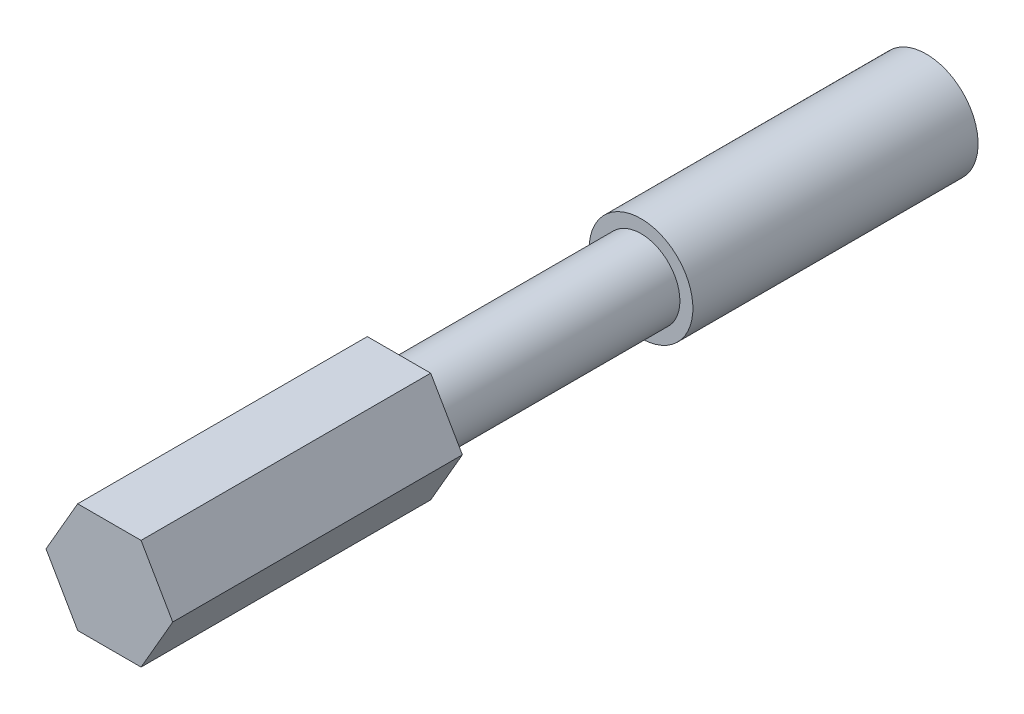
ISO-10303-21;
HEADER;
FILE_DESCRIPTION(('STEP AP214'),'2;1');
FILE_NAME('part.step','',(''),(''),'','','');
FILE_SCHEMA(('AUTOMOTIVE_DESIGN { 1 0 10303 214 1 1 1 1 }'));
ENDSEC;
DATA;
#1=APPLICATION_CONTEXT('core data for automotive mechanical design processes');
#2=APPLICATION_PROTOCOL_DEFINITION('international standard','automotive_design',2000,#1);
#3=PRODUCT_CONTEXT('',#1,'mechanical');
#4=PRODUCT('Part','Part','',(#3));
#5=PRODUCT_RELATED_PRODUCT_CATEGORY('part','',(#4));
#6=PRODUCT_DEFINITION_FORMATION('','',#4);
#7=PRODUCT_DEFINITION_CONTEXT('part definition',#1,'design');
#8=PRODUCT_DEFINITION('design','',#6,#7);
#9=PRODUCT_DEFINITION_SHAPE('','',#8);
#10=(LENGTH_UNIT() NAMED_UNIT(*) SI_UNIT(.MILLI.,.METRE.));
#11=(NAMED_UNIT(*) PLANE_ANGLE_UNIT() SI_UNIT($,.RADIAN.));
#12=(NAMED_UNIT(*) SI_UNIT($,.STERADIAN.) SOLID_ANGLE_UNIT());
#13=UNCERTAINTY_MEASURE_WITH_UNIT(LENGTH_MEASURE(1.E-05),#10,'distance_accuracy_value','');
#14=(GEOMETRIC_REPRESENTATION_CONTEXT(3) GLOBAL_UNCERTAINTY_ASSIGNED_CONTEXT((#13)) GLOBAL_UNIT_ASSIGNED_CONTEXT((#10,
#11,#12)) REPRESENTATION_CONTEXT('',''));
#15=CARTESIAN_POINT('',(0.,0.,0.));
#16=DIRECTION('',(0.,0.,1.));
#17=DIRECTION('',(1.,0.,0.));
#18=AXIS2_PLACEMENT_3D('',#15,#16,#17);
#19=CARTESIAN_POINT('',(0.,0.,-61.));
#20=DIRECTION('',(0.,0.,1.));
#21=DIRECTION('',(1.,0.,0.));
#22=AXIS2_PLACEMENT_3D('',#19,#20,#21);
#23=CYLINDRICAL_SURFACE('',#22,4.5);
#24=CARTESIAN_POINT('',(0.,0.,0.));
#25=DIRECTION('',(0.,0.,-1.));
#26=DIRECTION('',(-1.,0.,0.));
#27=AXIS2_PLACEMENT_3D('',#24,#25,#26);
#28=CIRCLE('',#27,4.5);
#29=CARTESIAN_POINT('',(4.5,0.,0.));
#30=VERTEX_POINT('',#29);
#31=EDGE_CURVE('E51',#30,#30,#28,.T.);
#32=CARTESIAN_POINT('',(0.,0.,-28.));
#33=DIRECTION('',(0.,0.,-1.));
#34=DIRECTION('',(-1.,0.,0.));
#35=AXIS2_PLACEMENT_3D('',#32,#33,#34);
#36=CIRCLE('',#35,4.5);
#37=CARTESIAN_POINT('',(4.5,0.,-28.));
#38=VERTEX_POINT('',#37);
#39=EDGE_CURVE('E11',#38,#38,#36,.T.);
#40=CARTESIAN_POINT('',(4.5,0.,0.));
#41=CARTESIAN_POINT('',(4.5,0.,-0.291666666666659));
#42=CARTESIAN_POINT('',(4.5,0.,-0.583333333333327));
#43=CARTESIAN_POINT('',(4.5,0.,-1.16666666666666));
#44=CARTESIAN_POINT('',(4.5,0.,-1.45833333333333));
#45=CARTESIAN_POINT('',(4.5,0.,-2.04166666666666));
#46=CARTESIAN_POINT('',(4.5,0.,-2.33333333333333));
#47=CARTESIAN_POINT('',(4.5,0.,-2.91666666666666));
#48=CARTESIAN_POINT('',(4.5,0.,-3.20833333333333));
#49=CARTESIAN_POINT('',(4.5,0.,-3.79166666666666));
#50=CARTESIAN_POINT('',(4.5,0.,-4.08333333333333));
#51=CARTESIAN_POINT('',(4.5,0.,-4.66666666666666));
#52=CARTESIAN_POINT('',(4.5,0.,-4.95833333333332));
#53=CARTESIAN_POINT('',(4.5,0.,-5.54166666666666));
#54=CARTESIAN_POINT('',(4.5,0.,-5.83333333333333));
#55=CARTESIAN_POINT('',(4.5,0.,-6.41666666666666));
#56=CARTESIAN_POINT('',(4.5,0.,-6.70833333333333));
#57=CARTESIAN_POINT('',(4.5,0.,-7.29166666666666));
#58=CARTESIAN_POINT('',(4.5,0.,-7.58333333333333));
#59=CARTESIAN_POINT('',(4.5,0.,-8.16666666666666));
#60=CARTESIAN_POINT('',(4.5,0.,-8.45833333333333));
#61=CARTESIAN_POINT('',(4.5,0.,-9.04166666666666));
#62=CARTESIAN_POINT('',(4.5,0.,-9.33333333333332));
#63=CARTESIAN_POINT('',(4.5,0.,-9.91666666666666));
#64=CARTESIAN_POINT('',(4.5,0.,-10.2083333333333));
#65=CARTESIAN_POINT('',(4.5,0.,-10.7916666666667));
#66=CARTESIAN_POINT('',(4.5,0.,-11.0833333333333));
#67=CARTESIAN_POINT('',(4.5,0.,-11.6666666666667));
#68=CARTESIAN_POINT('',(4.5,0.,-11.9583333333333));
#69=CARTESIAN_POINT('',(4.5,0.,-12.5416666666667));
#70=CARTESIAN_POINT('',(4.5,0.,-12.8333333333333));
#71=CARTESIAN_POINT('',(4.5,0.,-13.4166666666667));
#72=CARTESIAN_POINT('',(4.5,0.,-13.7083333333333));
#73=CARTESIAN_POINT('',(4.5,0.,-14.2916666666667));
#74=CARTESIAN_POINT('',(4.5,0.,-14.5833333333333));
#75=CARTESIAN_POINT('',(4.5,0.,-15.1666666666667));
#76=CARTESIAN_POINT('',(4.5,0.,-15.4583333333333));
#77=CARTESIAN_POINT('',(4.5,0.,-16.0416666666667));
#78=CARTESIAN_POINT('',(4.5,0.,-16.3333333333333));
#79=CARTESIAN_POINT('',(4.5,0.,-16.9166666666667));
#80=CARTESIAN_POINT('',(4.5,0.,-17.2083333333333));
#81=CARTESIAN_POINT('',(4.5,0.,-17.7916666666667));
#82=CARTESIAN_POINT('',(4.5,0.,-18.0833333333333));
#83=CARTESIAN_POINT('',(4.5,0.,-18.6666666666667));
#84=CARTESIAN_POINT('',(4.5,0.,-18.9583333333333));
#85=CARTESIAN_POINT('',(4.5,0.,-19.5416666666667));
#86=CARTESIAN_POINT('',(4.5,0.,-19.8333333333333));
#87=CARTESIAN_POINT('',(4.5,0.,-20.4166666666667));
#88=CARTESIAN_POINT('',(4.5,0.,-20.7083333333333));
#89=CARTESIAN_POINT('',(4.5,0.,-21.2916666666667));
#90=CARTESIAN_POINT('',(4.5,0.,-21.5833333333333));
#91=CARTESIAN_POINT('',(4.5,0.,-22.1666666666667));
#92=CARTESIAN_POINT('',(4.5,0.,-22.4583333333333));
#93=CARTESIAN_POINT('',(4.5,0.,-23.0416666666667));
#94=CARTESIAN_POINT('',(4.5,0.,-23.3333333333333));
#95=CARTESIAN_POINT('',(4.5,0.,-23.9166666666667));
#96=CARTESIAN_POINT('',(4.5,0.,-24.2083333333333));
#97=CARTESIAN_POINT('',(4.5,0.,-24.7916666666667));
#98=CARTESIAN_POINT('',(4.5,0.,-25.0833333333333));
#99=CARTESIAN_POINT('',(4.5,0.,-25.6666666666667));
#100=CARTESIAN_POINT('',(4.5,0.,-25.9583333333333));
#101=CARTESIAN_POINT('',(4.5,0.,-26.5416666666667));
#102=CARTESIAN_POINT('',(4.5,0.,-26.8333333333333));
#103=CARTESIAN_POINT('',(4.5,0.,-27.4166666666667));
#104=CARTESIAN_POINT('',(4.5,0.,-27.7083333333333));
#105=CARTESIAN_POINT('',(4.5,0.,-28.));
#106=B_SPLINE_CURVE_WITH_KNOTS('',3,(#40,#41,#42,#43,#44,#45,#46,#47,#48,#49,#50,#51,#52,#53,
#54,#55,#56,#57,#58,#59,#60,#61,#62,#63,#64,#65,#66,#67,#68,#69,#70,#71,#72,#73,#74,#75,#76,#77,
#78,#79,#80,#81,#82,#83,#84,#85,#86,#87,#88,#89,#90,#91,#92,#93,#94,#95,#96,#97,#98,#99,#100,
#101,#102,#103,#104,#105),.UNSPECIFIED.,.F.,.F.,(4,2,2,2,2,2,2,2,2,2,2,2,2,2,2,2,2,2,2,2,2,2,2,
2,2,2,2,2,2,2,2,2,4),(0.,0.875000000000001,1.75,2.625,3.5,4.375,5.25,6.125,7.,7.875,8.75,
9.62499999999999,10.5,11.375,12.25,13.125,14.,14.875,15.75,16.625,17.5,18.375,19.25,20.125,21.,
21.875,22.75,23.625,24.5,25.375,26.25,27.125,28.),.UNSPECIFIED.);
#107=EDGE_CURVE('BSEAM43',#30,#38,#106,.T.);
#108=ORIENTED_EDGE('',*,*,#31,.T.);
#109=ORIENTED_EDGE('',*,*,#39,.F.);
#110=ORIENTED_EDGE('',*,*,#107,.T.);
#111=ORIENTED_EDGE('',*,*,#107,.F.);
#112=EDGE_LOOP('',(#108,#110,#109,#111));
#113=FACE_BOUND('',#112,.T.);
#114=ADVANCED_FACE('F43',(#113),#23,.T.);
#115=CARTESIAN_POINT('',(-3.66617420935412,-6.35,27.));
#116=DIRECTION('',(0.,1.,0.));
#117=DIRECTION('',(-1.,0.,0.));
#118=AXIS2_PLACEMENT_3D('',#115,#116,#117);
#119=PLANE('',#118);
#120=DIRECTION('',(1.,0.,0.));
#121=VECTOR('',#120,1.);
#122=CARTESIAN_POINT('',(-3.66617420935412,-6.35,0.));
#123=LINE('',#122,#121);
#124=CARTESIAN_POINT('',(-3.66617420935412,-6.35,0.));
#125=VERTEX_POINT('',#124);
#126=CARTESIAN_POINT('',(3.66617420935412,-6.35,0.));
#127=VERTEX_POINT('',#126);
#128=EDGE_CURVE('E187',#125,#127,#123,.T.);
#129=ORIENTED_EDGE('',*,*,#128,.T.);
#130=DIRECTION('',(0.,0.,-1.));
#131=VECTOR('',#130,1.);
#132=CARTESIAN_POINT('',(3.66617420935412,-6.35,27.));
#133=LINE('',#132,#131);
#134=CARTESIAN_POINT('',(3.66617420935412,-6.35,33.51));
#135=VERTEX_POINT('',#134);
#136=EDGE_CURVE('E195',#135,#127,#133,.T.);
#137=ORIENTED_EDGE('',*,*,#136,.F.);
#138=DIRECTION('',(1.,0.,0.));
#139=VECTOR('',#138,1.);
#140=CARTESIAN_POINT('',(-3.66617420935412,-6.35,33.51));
#141=LINE('',#140,#139);
#142=CARTESIAN_POINT('',(-3.66617420935412,-6.35,33.51));
#143=VERTEX_POINT('',#142);
#144=EDGE_CURVE('E150',#143,#135,#141,.T.);
#145=ORIENTED_EDGE('',*,*,#144,.F.);
#146=DIRECTION('',(0.,0.,-1.));
#147=VECTOR('',#146,1.);
#148=CARTESIAN_POINT('',(-3.66617420935412,-6.35,27.));
#149=LINE('',#148,#147);
#150=EDGE_CURVE('E206',#143,#125,#149,.T.);
#151=ORIENTED_EDGE('',*,*,#150,.T.);
#152=EDGE_LOOP('',(#129,#137,#145,#151));
#153=FACE_BOUND('',#152,.T.);
#154=ADVANCED_FACE('F45',(#153),#119,.F.);
#155=CARTESIAN_POINT('',(3.66617420935412,-6.35,27.));
#156=DIRECTION('',(-0.866025403784439,0.5,0.));
#157=DIRECTION('',(-0.5,-0.866025403784439,0.));
#158=AXIS2_PLACEMENT_3D('',#155,#156,#157);
#159=PLANE('',#158);
#160=DIRECTION('',(0.5,0.866025403784439,0.));
#161=VECTOR('',#160,1.);
#162=CARTESIAN_POINT('',(3.66617420935412,-6.35,0.));
#163=LINE('',#162,#161);
#164=CARTESIAN_POINT('',(7.33234841870825,0.,0.));
#165=VERTEX_POINT('',#164);
#166=EDGE_CURVE('E198',#127,#165,#163,.T.);
#167=ORIENTED_EDGE('',*,*,#166,.T.);
#168=DIRECTION('',(0.,0.,-1.));
#169=VECTOR('',#168,1.);
#170=CARTESIAN_POINT('',(7.33234841870825,0.,27.));
#171=LINE('',#170,#169);
#172=CARTESIAN_POINT('',(7.33234841870825,0.,33.51));
#173=VERTEX_POINT('',#172);
#174=EDGE_CURVE('E210',#173,#165,#171,.T.);
#175=ORIENTED_EDGE('',*,*,#174,.F.);
#176=DIRECTION('',(0.5,0.866025403784439,0.));
#177=VECTOR('',#176,1.);
#178=CARTESIAN_POINT('',(3.66617420935412,-6.35,33.51));
#179=LINE('',#178,#177);
#180=EDGE_CURVE('E153',#135,#173,#179,.T.);
#181=ORIENTED_EDGE('',*,*,#180,.F.);
#182=ORIENTED_EDGE('',*,*,#136,.T.);
#183=EDGE_LOOP('',(#167,#175,#181,#182));
#184=FACE_BOUND('',#183,.T.);
#185=ADVANCED_FACE('F215',(#184),#159,.F.);
#186=CARTESIAN_POINT('',(7.33234841870825,0.,27.));
#187=DIRECTION('',(-0.866025403784439,-0.5,0.));
#188=DIRECTION('',(0.5,-0.866025403784439,0.));
#189=AXIS2_PLACEMENT_3D('',#186,#187,#188);
#190=PLANE('',#189);
#191=DIRECTION('',(-0.5,0.866025403784439,0.));
#192=VECTOR('',#191,1.);
#193=CARTESIAN_POINT('',(7.33234841870825,0.,0.));
#194=LINE('',#193,#192);
#195=CARTESIAN_POINT('',(3.66617420935412,6.35,0.));
#196=VERTEX_POINT('',#195);
#197=EDGE_CURVE('E200',#165,#196,#194,.T.);
#198=ORIENTED_EDGE('',*,*,#197,.T.);
#199=DIRECTION('',(0.,0.,-1.));
#200=VECTOR('',#199,1.);
#201=CARTESIAN_POINT('',(3.66617420935412,6.35,27.));
#202=LINE('',#201,#200);
#203=CARTESIAN_POINT('',(3.66617420935412,6.35,33.51));
#204=VERTEX_POINT('',#203);
#205=EDGE_CURVE('E131',#204,#196,#202,.T.);
#206=ORIENTED_EDGE('',*,*,#205,.F.);
#207=DIRECTION('',(-0.5,0.866025403784439,0.));
#208=VECTOR('',#207,1.);
#209=CARTESIAN_POINT('',(7.33234841870825,0.,33.51));
#210=LINE('',#209,#208);
#211=EDGE_CURVE('E146',#173,#204,#210,.T.);
#212=ORIENTED_EDGE('',*,*,#211,.F.);
#213=ORIENTED_EDGE('',*,*,#174,.T.);
#214=EDGE_LOOP('',(#198,#206,#212,#213));
#215=FACE_BOUND('',#214,.T.);
#216=ADVANCED_FACE('F223',(#215),#190,.F.);
#217=CARTESIAN_POINT('',(3.66617420935412,6.35,27.));
#218=DIRECTION('',(0.,-1.,0.));
#219=DIRECTION('',(1.,0.,0.));
#220=AXIS2_PLACEMENT_3D('',#217,#218,#219);
#221=PLANE('',#220);
#222=DIRECTION('',(-1.,0.,0.));
#223=VECTOR('',#222,1.);
#224=CARTESIAN_POINT('',(3.66617420935412,6.35,0.));
#225=LINE('',#224,#223);
#226=CARTESIAN_POINT('',(-3.66617420935412,6.35,0.));
#227=VERTEX_POINT('',#226);
#228=EDGE_CURVE('E128',#196,#227,#225,.T.);
#229=ORIENTED_EDGE('',*,*,#228,.T.);
#230=DIRECTION('',(0.,0.,-1.));
#231=VECTOR('',#230,1.);
#232=CARTESIAN_POINT('',(-3.66617420935412,6.35,27.));
#233=LINE('',#232,#231);
#234=CARTESIAN_POINT('',(-3.66617420935412,6.35,33.51));
#235=VERTEX_POINT('',#234);
#236=EDGE_CURVE('E121',#235,#227,#233,.T.);
#237=ORIENTED_EDGE('',*,*,#236,.F.);
#238=DIRECTION('',(-1.,0.,0.));
#239=VECTOR('',#238,1.);
#240=CARTESIAN_POINT('',(3.66617420935412,6.35,33.51));
#241=LINE('',#240,#239);
#242=EDGE_CURVE('E126',#204,#235,#241,.T.);
#243=ORIENTED_EDGE('',*,*,#242,.F.);
#244=ORIENTED_EDGE('',*,*,#205,.T.);
#245=EDGE_LOOP('',(#229,#237,#243,#244));
#246=FACE_BOUND('',#245,.T.);
#247=ADVANCED_FACE('F123',(#246),#221,.F.);
#248=CARTESIAN_POINT('',(-3.66617420935412,6.35,27.));
#249=DIRECTION('',(0.866025403784439,-0.5,0.));
#250=DIRECTION('',(0.5,0.866025403784439,0.));
#251=AXIS2_PLACEMENT_3D('',#248,#249,#250);
#252=PLANE('',#251);
#253=DIRECTION('',(-0.5,-0.866025403784439,0.));
#254=VECTOR('',#253,1.);
#255=CARTESIAN_POINT('',(-3.66617420935412,6.35,0.));
#256=LINE('',#255,#254);
#257=CARTESIAN_POINT('',(-7.33234841870825,0.,0.));
#258=VERTEX_POINT('',#257);
#259=EDGE_CURVE('E203',#227,#258,#256,.T.);
#260=ORIENTED_EDGE('',*,*,#259,.T.);
#261=DIRECTION('',(0.,0.,-1.));
#262=VECTOR('',#261,1.);
#263=CARTESIAN_POINT('',(-7.33234841870825,0.,27.));
#264=LINE('',#263,#262);
#265=CARTESIAN_POINT('',(-7.33234841870825,0.,33.51));
#266=VERTEX_POINT('',#265);
#267=EDGE_CURVE('E132',#266,#258,#264,.T.);
#268=ORIENTED_EDGE('',*,*,#267,.F.);
#269=DIRECTION('',(-0.5,-0.866025403784439,0.));
#270=VECTOR('',#269,1.);
#271=CARTESIAN_POINT('',(-3.66617420935412,6.35,33.51));
#272=LINE('',#271,#270);
#273=EDGE_CURVE('E135',#235,#266,#272,.T.);
#274=ORIENTED_EDGE('',*,*,#273,.F.);
#275=ORIENTED_EDGE('',*,*,#236,.T.);
#276=EDGE_LOOP('',(#260,#268,#274,#275));
#277=FACE_BOUND('',#276,.T.);
#278=ADVANCED_FACE('F136',(#277),#252,.F.);
#279=CARTESIAN_POINT('',(-7.33234841870825,0.,27.));
#280=DIRECTION('',(0.866025403784439,0.5,0.));
#281=DIRECTION('',(-0.5,0.866025403784439,0.));
#282=AXIS2_PLACEMENT_3D('',#279,#280,#281);
#283=PLANE('',#282);
#284=DIRECTION('',(0.5,-0.866025403784439,0.));
#285=VECTOR('',#284,1.);
#286=CARTESIAN_POINT('',(-7.33234841870825,0.,0.));
#287=LINE('',#286,#285);
#288=EDGE_CURVE('E66',#258,#125,#287,.T.);
#289=ORIENTED_EDGE('',*,*,#288,.T.);
#290=ORIENTED_EDGE('',*,*,#150,.F.);
#291=DIRECTION('',(0.5,-0.866025403784439,0.));
#292=VECTOR('',#291,1.);
#293=CARTESIAN_POINT('',(-7.33234841870825,0.,33.51));
#294=LINE('',#293,#292);
#295=EDGE_CURVE('E140',#266,#143,#294,.T.);
#296=ORIENTED_EDGE('',*,*,#295,.F.);
#297=ORIENTED_EDGE('',*,*,#267,.T.);
#298=EDGE_LOOP('',(#289,#290,#296,#297));
#299=FACE_BOUND('',#298,.T.);
#300=ADVANCED_FACE('F224',(#299),#283,.F.);
#301=CARTESIAN_POINT('',(0.,0.,0.));
#302=DIRECTION('',(0.,0.,1.));
#303=DIRECTION('',(1.,0.,0.));
#304=AXIS2_PLACEMENT_3D('',#301,#302,#303);
#305=PLANE('',#304);
#306=ORIENTED_EDGE('',*,*,#31,.F.);
#307=EDGE_LOOP('',(#306));
#308=FACE_BOUND('',#307,.T.);
#309=ORIENTED_EDGE('',*,*,#128,.F.);
#310=ORIENTED_EDGE('',*,*,#288,.F.);
#311=ORIENTED_EDGE('',*,*,#259,.F.);
#312=ORIENTED_EDGE('',*,*,#228,.F.);
#313=ORIENTED_EDGE('',*,*,#197,.F.);
#314=ORIENTED_EDGE('',*,*,#166,.F.);
#315=EDGE_LOOP('',(#309,#310,#311,#312,#313,#314));
#316=FACE_BOUND('',#315,.T.);
#317=ADVANCED_FACE('F220',(#308,#316),#305,.F.);
#318=CARTESIAN_POINT('',(0.,0.,-28.));
#319=DIRECTION('',(0.,0.,-1.));
#320=DIRECTION('',(-1.,0.,0.));
#321=AXIS2_PLACEMENT_3D('',#318,#319,#320);
#322=CYLINDRICAL_SURFACE('',#321,6.);
#323=CARTESIAN_POINT('',(0.,0.,-28.));
#324=DIRECTION('',(0.,0.,-1.));
#325=DIRECTION('',(-1.,0.,0.));
#326=AXIS2_PLACEMENT_3D('',#323,#324,#325);
#327=CIRCLE('',#326,6.);
#328=CARTESIAN_POINT('',(-6.,0.,-28.));
#329=VERTEX_POINT('',#328);
#330=EDGE_CURVE('E157',#329,#329,#327,.T.);
#331=ORIENTED_EDGE('',*,*,#330,.T.);
#332=EDGE_LOOP('',(#331));
#333=FACE_BOUND('',#332,.T.);
#334=CARTESIAN_POINT('',(0.,0.,-61.));
#335=DIRECTION('',(0.,0.,-1.));
#336=DIRECTION('',(-1.,0.,0.));
#337=AXIS2_PLACEMENT_3D('',#334,#335,#336);
#338=CIRCLE('',#337,6.);
#339=CARTESIAN_POINT('',(-6.,0.,-61.));
#340=VERTEX_POINT('',#339);
#341=EDGE_CURVE('E156',#340,#340,#338,.T.);
#342=ORIENTED_EDGE('',*,*,#341,.F.);
#343=EDGE_LOOP('',(#342));
#344=FACE_BOUND('',#343,.T.);
#345=ADVANCED_FACE('F232',(#333,#344),#322,.T.);
#346=CARTESIAN_POINT('',(0.,0.,-28.));
#347=DIRECTION('',(0.,0.,-1.));
#348=DIRECTION('',(-1.,0.,0.));
#349=AXIS2_PLACEMENT_3D('',#346,#347,#348);
#350=PLANE('',#349);
#351=ORIENTED_EDGE('',*,*,#39,.T.);
#352=EDGE_LOOP('',(#351));
#353=FACE_BOUND('',#352,.T.);
#354=ORIENTED_EDGE('',*,*,#330,.F.);
#355=EDGE_LOOP('',(#354));
#356=FACE_BOUND('',#355,.T.);
#357=ADVANCED_FACE('F267',(#353,#356),#350,.F.);
#358=CARTESIAN_POINT('',(0.,0.,-47.));
#359=DIRECTION('',(0.,0.,-1.));
#360=DIRECTION('',(-1.,0.,0.));
#361=AXIS2_PLACEMENT_3D('',#358,#359,#360);
#362=PLANE('',#361);
#363=CARTESIAN_POINT('',(0.,0.,-47.));
#364=DIRECTION('',(0.,0.,-1.));
#365=DIRECTION('',(-1.,0.,0.));
#366=AXIS2_PLACEMENT_3D('',#363,#364,#365);
#367=CIRCLE('',#366,4.);
#368=CARTESIAN_POINT('',(2.64575131106459,3.,-47.));
#369=VERTEX_POINT('',#368);
#370=CARTESIAN_POINT('',(2.64575131106459,-3.,-47.));
#371=VERTEX_POINT('',#370);
#372=EDGE_CURVE('E162',#369,#371,#367,.T.);
#373=ORIENTED_EDGE('',*,*,#372,.T.);
#374=DIRECTION('',(-1.,0.,0.));
#375=VECTOR('',#374,1.);
#376=CARTESIAN_POINT('',(2.64575131106459,-3.,-47.));
#377=LINE('',#376,#375);
#378=CARTESIAN_POINT('',(-2.64575131106459,-3.,-47.));
#379=VERTEX_POINT('',#378);
#380=EDGE_CURVE('E165',#371,#379,#377,.T.);
#381=ORIENTED_EDGE('',*,*,#380,.T.);
#382=CARTESIAN_POINT('',(0.,0.,-47.));
#383=DIRECTION('',(0.,0.,-1.));
#384=DIRECTION('',(-1.,0.,0.));
#385=AXIS2_PLACEMENT_3D('',#382,#383,#384);
#386=CIRCLE('',#385,4.);
#387=CARTESIAN_POINT('',(-2.64575131106459,3.,-47.));
#388=VERTEX_POINT('',#387);
#389=EDGE_CURVE('E169',#379,#388,#386,.T.);
#390=ORIENTED_EDGE('',*,*,#389,.T.);
#391=DIRECTION('',(1.,0.,0.));
#392=VECTOR('',#391,1.);
#393=CARTESIAN_POINT('',(2.64575131106459,3.,-47.));
#394=LINE('',#393,#392);
#395=EDGE_CURVE('E172',#388,#369,#394,.T.);
#396=ORIENTED_EDGE('',*,*,#395,.T.);
#397=EDGE_LOOP('',(#373,#381,#390,#396));
#398=FACE_BOUND('',#397,.T.);
#399=ADVANCED_FACE('F258',(#398),#362,.T.);
#400=CARTESIAN_POINT('',(2.64575131106459,-3.,-47.));
#401=DIRECTION('',(0.,-1.,0.));
#402=DIRECTION('',(0.,0.,-1.));
#403=AXIS2_PLACEMENT_3D('',#400,#401,#402);
#404=PLANE('',#403);
#405=DIRECTION('',(-1.,0.,0.));
#406=VECTOR('',#405,1.);
#407=CARTESIAN_POINT('',(2.64575131106459,-3.,-61.));
#408=LINE('',#407,#406);
#409=CARTESIAN_POINT('',(2.64575131106459,-3.,-61.));
#410=VERTEX_POINT('',#409);
#411=CARTESIAN_POINT('',(-2.64575131106459,-3.,-61.));
#412=VERTEX_POINT('',#411);
#413=EDGE_CURVE('E177',#410,#412,#408,.T.);
#414=ORIENTED_EDGE('',*,*,#413,.T.);
#415=DIRECTION('',(0.,0.,-1.));
#416=VECTOR('',#415,1.);
#417=CARTESIAN_POINT('',(-2.64575131106459,-3.,-47.));
#418=LINE('',#417,#416);
#419=EDGE_CURVE('E190',#379,#412,#418,.T.);
#420=ORIENTED_EDGE('',*,*,#419,.F.);
#421=ORIENTED_EDGE('',*,*,#380,.F.);
#422=DIRECTION('',(0.,0.,-1.));
#423=VECTOR('',#422,1.);
#424=CARTESIAN_POINT('',(2.64575131106459,-3.,-47.));
#425=LINE('',#424,#423);
#426=EDGE_CURVE('E175',#371,#410,#425,.T.);
#427=ORIENTED_EDGE('',*,*,#426,.T.);
#428=EDGE_LOOP('',(#414,#420,#421,#427));
#429=FACE_BOUND('',#428,.T.);
#430=ADVANCED_FACE('F254',(#429),#404,.F.);
#431=CARTESIAN_POINT('',(0.,0.,-47.));
#432=DIRECTION('',(0.,0.,-1.));
#433=DIRECTION('',(-1.,0.,0.));
#434=AXIS2_PLACEMENT_3D('',#431,#432,#433);
#435=CYLINDRICAL_SURFACE('',#434,4.);
#436=CARTESIAN_POINT('',(0.,0.,-61.));
#437=DIRECTION('',(0.,0.,-1.));
#438=DIRECTION('',(-1.,0.,0.));
#439=AXIS2_PLACEMENT_3D('',#436,#437,#438);
#440=CIRCLE('',#439,4.);
#441=CARTESIAN_POINT('',(-2.64575131106459,3.,-61.));
#442=VERTEX_POINT('',#441);
#443=EDGE_CURVE('E180',#412,#442,#440,.T.);
#444=ORIENTED_EDGE('',*,*,#443,.T.);
#445=DIRECTION('',(0.,0.,-1.));
#446=VECTOR('',#445,1.);
#447=CARTESIAN_POINT('',(-2.64575131106459,3.,-47.));
#448=LINE('',#447,#446);
#449=EDGE_CURVE('E188',#388,#442,#448,.T.);
#450=ORIENTED_EDGE('',*,*,#449,.F.);
#451=ORIENTED_EDGE('',*,*,#389,.F.);
#452=ORIENTED_EDGE('',*,*,#419,.T.);
#453=EDGE_LOOP('',(#444,#450,#451,#452));
#454=FACE_BOUND('',#453,.T.);
#455=ADVANCED_FACE('F257',(#454),#435,.F.);
#456=CARTESIAN_POINT('',(2.64575131106459,3.,-47.));
#457=DIRECTION('',(0.,1.,0.));
#458=DIRECTION('',(0.,0.,1.));
#459=AXIS2_PLACEMENT_3D('',#456,#457,#458);
#460=PLANE('',#459);
#461=DIRECTION('',(1.,0.,0.));
#462=VECTOR('',#461,1.);
#463=CARTESIAN_POINT('',(2.64575131106459,3.,-61.));
#464=LINE('',#463,#462);
#465=CARTESIAN_POINT('',(2.64575131106459,3.,-61.));
#466=VERTEX_POINT('',#465);
#467=EDGE_CURVE('E166',#442,#466,#464,.T.);
#468=ORIENTED_EDGE('',*,*,#467,.T.);
#469=DIRECTION('',(0.,0.,-1.));
#470=VECTOR('',#469,1.);
#471=CARTESIAN_POINT('',(2.64575131106459,3.,-47.));
#472=LINE('',#471,#470);
#473=EDGE_CURVE('E185',#369,#466,#472,.T.);
#474=ORIENTED_EDGE('',*,*,#473,.F.);
#475=ORIENTED_EDGE('',*,*,#395,.F.);
#476=ORIENTED_EDGE('',*,*,#449,.T.);
#477=EDGE_LOOP('',(#468,#474,#475,#476));
#478=FACE_BOUND('',#477,.T.);
#479=ADVANCED_FACE('F253',(#478),#460,.F.);
#480=CARTESIAN_POINT('',(0.,0.,-47.));
#481=DIRECTION('',(0.,0.,-1.));
#482=DIRECTION('',(-1.,0.,0.));
#483=AXIS2_PLACEMENT_3D('',#480,#481,#482);
#484=CYLINDRICAL_SURFACE('',#483,4.);
#485=CARTESIAN_POINT('',(0.,0.,-61.));
#486=DIRECTION('',(0.,0.,-1.));
#487=DIRECTION('',(-1.,0.,0.));
#488=AXIS2_PLACEMENT_3D('',#485,#486,#487);
#489=CIRCLE('',#488,4.);
#490=EDGE_CURVE('E58',#466,#410,#489,.T.);
#491=ORIENTED_EDGE('',*,*,#490,.T.);
#492=ORIENTED_EDGE('',*,*,#426,.F.);
#493=ORIENTED_EDGE('',*,*,#372,.F.);
#494=ORIENTED_EDGE('',*,*,#473,.T.);
#495=EDGE_LOOP('',(#491,#492,#493,#494));
#496=FACE_BOUND('',#495,.T.);
#497=ADVANCED_FACE('F249',(#496),#484,.F.);
#498=CARTESIAN_POINT('',(0.,0.,-61.));
#499=DIRECTION('',(0.,0.,-1.));
#500=DIRECTION('',(-1.,0.,0.));
#501=AXIS2_PLACEMENT_3D('',#498,#499,#500);
#502=PLANE('',#501);
#503=ORIENTED_EDGE('',*,*,#490,.F.);
#504=ORIENTED_EDGE('',*,*,#467,.F.);
#505=ORIENTED_EDGE('',*,*,#443,.F.);
#506=ORIENTED_EDGE('',*,*,#413,.F.);
#507=EDGE_LOOP('',(#503,#504,#505,#506));
#508=FACE_BOUND('',#507,.T.);
#509=ORIENTED_EDGE('',*,*,#341,.T.);
#510=EDGE_LOOP('',(#509));
#511=FACE_BOUND('',#510,.T.);
#512=ADVANCED_FACE('F246',(#508,#511),#502,.T.);
#513=CARTESIAN_POINT('',(0.,0.,33.51));
#514=DIRECTION('',(0.,0.,1.));
#515=DIRECTION('',(1.,0.,0.));
#516=AXIS2_PLACEMENT_3D('',#513,#514,#515);
#517=PLANE('',#516);
#518=ORIENTED_EDGE('',*,*,#242,.T.);
#519=ORIENTED_EDGE('',*,*,#273,.T.);
#520=ORIENTED_EDGE('',*,*,#295,.T.);
#521=ORIENTED_EDGE('',*,*,#144,.T.);
#522=ORIENTED_EDGE('',*,*,#180,.T.);
#523=ORIENTED_EDGE('',*,*,#211,.T.);
#524=EDGE_LOOP('',(#518,#519,#520,#521,#522,#523));
#525=FACE_BOUND('',#524,.T.);
#526=ADVANCED_FACE('F143',(#525),#517,.T.);
#527=CLOSED_SHELL('',(#114,#154,#185,#216,#247,#278,#300,#317,#345,#357,#399,#430,#455,#479,
#497,#512,#526));
#528=MANIFOLD_SOLID_BREP('B2',#527);
#529=ADVANCED_BREP_SHAPE_REPRESENTATION('',(#18,#528),#14);
#530=SHAPE_DEFINITION_REPRESENTATION(#9,#529);
ENDSEC;
END-ISO-10303-21;
